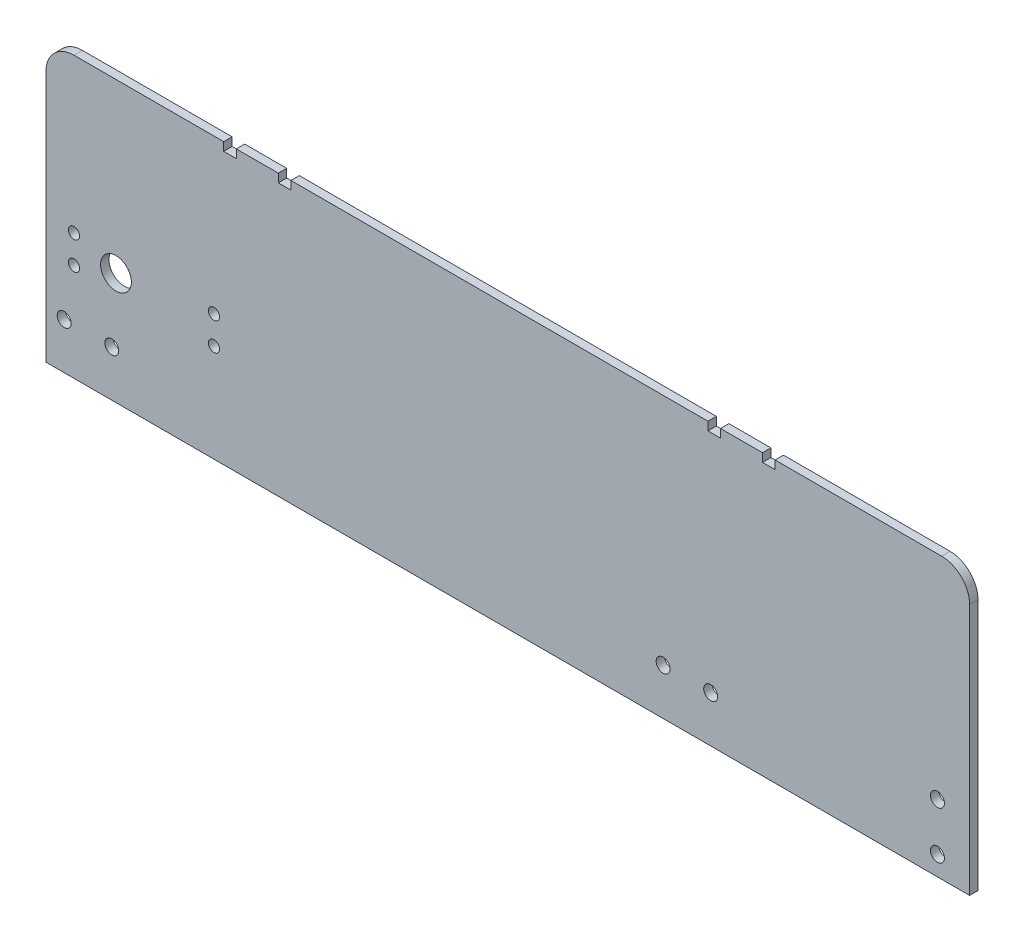
ISO-10303-21;
HEADER;
FILE_DESCRIPTION(('STEP AP214'),'2;1');
FILE_NAME('part.step','',(''),(''),'','','');
FILE_SCHEMA(('AUTOMOTIVE_DESIGN { 1 0 10303 214 1 1 1 1 }'));
ENDSEC;
DATA;
#1=APPLICATION_CONTEXT('core data for automotive mechanical design processes');
#2=APPLICATION_PROTOCOL_DEFINITION('international standard','automotive_design',2000,#1);
#3=PRODUCT_CONTEXT('',#1,'mechanical');
#4=PRODUCT('Part','Part','',(#3));
#5=PRODUCT_RELATED_PRODUCT_CATEGORY('part','',(#4));
#6=PRODUCT_DEFINITION_FORMATION('','',#4);
#7=PRODUCT_DEFINITION_CONTEXT('part definition',#1,'design');
#8=PRODUCT_DEFINITION('design','',#6,#7);
#9=PRODUCT_DEFINITION_SHAPE('','',#8);
#10=(LENGTH_UNIT() NAMED_UNIT(*) SI_UNIT(.MILLI.,.METRE.));
#11=(NAMED_UNIT(*) PLANE_ANGLE_UNIT() SI_UNIT($,.RADIAN.));
#12=(NAMED_UNIT(*) SI_UNIT($,.STERADIAN.) SOLID_ANGLE_UNIT());
#13=UNCERTAINTY_MEASURE_WITH_UNIT(LENGTH_MEASURE(1.E-05),#10,'distance_accuracy_value','');
#14=(GEOMETRIC_REPRESENTATION_CONTEXT(3) GLOBAL_UNCERTAINTY_ASSIGNED_CONTEXT((#13)) GLOBAL_UNIT_ASSIGNED_CONTEXT((#10,
#11,#12)) REPRESENTATION_CONTEXT('',''));
#15=CARTESIAN_POINT('',(0.,0.,0.));
#16=DIRECTION('',(0.,0.,1.));
#17=DIRECTION('',(1.,0.,0.));
#18=AXIS2_PLACEMENT_3D('',#15,#16,#17);
#19=CARTESIAN_POINT('',(10.,100.,1.5));
#20=DIRECTION('',(0.,-1.,0.));
#21=DIRECTION('',(0.,0.,-1.));
#22=AXIS2_PLACEMENT_3D('',#19,#20,#21);
#23=PLANE('',#22);
#24=DIRECTION('',(-1.,0.,0.));
#25=VECTOR('',#24,1.);
#26=CARTESIAN_POINT('',(10.,100.,1.5));
#27=LINE('',#26,#25);
#28=CARTESIAN_POINT('',(83.,100.,1.5));
#29=VERTEX_POINT('',#28);
#30=CARTESIAN_POINT('',(68.,100.,1.5));
#31=VERTEX_POINT('',#30);
#32=EDGE_CURVE('E345',#29,#31,#27,.T.);
#33=ORIENTED_EDGE('',*,*,#32,.F.);
#34=DIRECTION('',(0.,0.,1.));
#35=VECTOR('',#34,1.);
#36=CARTESIAN_POINT('',(83.,100.,-8.5));
#37=LINE('',#36,#35);
#38=CARTESIAN_POINT('',(83.,100.,-1.5));
#39=VERTEX_POINT('',#38);
#40=EDGE_CURVE('E199',#39,#29,#37,.T.);
#41=ORIENTED_EDGE('',*,*,#40,.F.);
#42=DIRECTION('',(-1.,0.,0.));
#43=VECTOR('',#42,1.);
#44=CARTESIAN_POINT('',(10.,100.,-1.5));
#45=LINE('',#44,#43);
#46=CARTESIAN_POINT('',(68.,100.,-1.5));
#47=VERTEX_POINT('',#46);
#48=EDGE_CURVE('E361',#39,#47,#45,.T.);
#49=ORIENTED_EDGE('',*,*,#48,.T.);
#50=DIRECTION('',(0.,0.,1.));
#51=VECTOR('',#50,1.);
#52=CARTESIAN_POINT('',(68.,100.,1.5));
#53=LINE('',#52,#51);
#54=EDGE_CURVE('E390',#47,#31,#53,.T.);
#55=ORIENTED_EDGE('',*,*,#54,.T.);
#56=EDGE_LOOP('',(#33,#41,#49,#55));
#57=FACE_BOUND('',#56,.T.);
#58=ADVANCED_FACE('F37',(#57),#23,.F.);
#59=CARTESIAN_POINT('',(236.5,100.,-1.5));
#60=VERTEX_POINT('',#59);
#61=CARTESIAN_POINT('',(87.5,100.,-1.5));
#62=VERTEX_POINT('',#61);
#63=EDGE_CURVE('E418',#60,#62,#45,.T.);
#64=ORIENTED_EDGE('',*,*,#63,.T.);
#65=DIRECTION('',(0.,0.,1.));
#66=VECTOR('',#65,1.);
#67=CARTESIAN_POINT('',(87.5,100.,-8.5));
#68=LINE('',#67,#66);
#69=CARTESIAN_POINT('',(87.5,100.,1.5));
#70=VERTEX_POINT('',#69);
#71=EDGE_CURVE('E212',#62,#70,#68,.T.);
#72=ORIENTED_EDGE('',*,*,#71,.T.);
#73=CARTESIAN_POINT('',(236.5,100.,1.5));
#74=VERTEX_POINT('',#73);
#75=EDGE_CURVE('E443',#74,#70,#27,.T.);
#76=ORIENTED_EDGE('',*,*,#75,.F.);
#77=DIRECTION('',(0.,0.,1.));
#78=VECTOR('',#77,1.);
#79=CARTESIAN_POINT('',(236.5,100.,-8.5));
#80=LINE('',#79,#78);
#81=EDGE_CURVE('E223',#60,#74,#80,.T.);
#82=ORIENTED_EDGE('',*,*,#81,.F.);
#83=EDGE_LOOP('',(#64,#72,#76,#82));
#84=FACE_BOUND('',#83,.T.);
#85=ADVANCED_FACE('F422',(#84),#23,.F.);
#86=CARTESIAN_POINT('',(63.5,100.,1.5));
#87=VERTEX_POINT('',#86);
#88=CARTESIAN_POINT('',(10.,100.,1.5));
#89=VERTEX_POINT('',#88);
#90=EDGE_CURVE('E339',#87,#89,#27,.T.);
#91=ORIENTED_EDGE('',*,*,#90,.F.);
#92=DIRECTION('',(0.,0.,-1.));
#93=VECTOR('',#92,1.);
#94=CARTESIAN_POINT('',(63.5,100.,1.5));
#95=LINE('',#94,#93);
#96=CARTESIAN_POINT('',(63.5,100.,-1.5));
#97=VERTEX_POINT('',#96);
#98=EDGE_CURVE('E393',#87,#97,#95,.T.);
#99=ORIENTED_EDGE('',*,*,#98,.T.);
#100=CARTESIAN_POINT('',(10.,100.,-1.5));
#101=VERTEX_POINT('',#100);
#102=EDGE_CURVE('E356',#97,#101,#45,.T.);
#103=ORIENTED_EDGE('',*,*,#102,.T.);
#104=DIRECTION('',(0.,0.,-1.));
#105=VECTOR('',#104,1.);
#106=CARTESIAN_POINT('',(10.,100.,1.5));
#107=LINE('',#106,#105);
#108=EDGE_CURVE('E365',#89,#101,#107,.T.);
#109=ORIENTED_EDGE('',*,*,#108,.F.);
#110=EDGE_LOOP('',(#91,#99,#103,#109));
#111=FACE_BOUND('',#110,.T.);
#112=ADVANCED_FACE('F429',(#111),#23,.F.);
#113=CARTESIAN_POINT('',(256.,100.,-1.5));
#114=VERTEX_POINT('',#113);
#115=CARTESIAN_POINT('',(241.,100.,-1.5));
#116=VERTEX_POINT('',#115);
#117=EDGE_CURVE('E360',#114,#116,#45,.T.);
#118=ORIENTED_EDGE('',*,*,#117,.T.);
#119=DIRECTION('',(0.,0.,1.));
#120=VECTOR('',#119,1.);
#121=CARTESIAN_POINT('',(241.,100.,-8.5));
#122=LINE('',#121,#120);
#123=CARTESIAN_POINT('',(241.,100.,1.5));
#124=VERTEX_POINT('',#123);
#125=EDGE_CURVE('E220',#116,#124,#122,.T.);
#126=ORIENTED_EDGE('',*,*,#125,.T.);
#127=CARTESIAN_POINT('',(256.,100.,1.5));
#128=VERTEX_POINT('',#127);
#129=EDGE_CURVE('E344',#128,#124,#27,.T.);
#130=ORIENTED_EDGE('',*,*,#129,.F.);
#131=DIRECTION('',(0.,0.,-1.));
#132=VECTOR('',#131,1.);
#133=CARTESIAN_POINT('',(256.,100.,1.5));
#134=LINE('',#133,#132);
#135=EDGE_CURVE('E387',#128,#114,#134,.T.);
#136=ORIENTED_EDGE('',*,*,#135,.T.);
#137=EDGE_LOOP('',(#118,#126,#130,#136));
#138=FACE_BOUND('',#137,.T.);
#139=ADVANCED_FACE('F458',(#138),#23,.F.);
#140=CARTESIAN_POINT('',(10.,90.,1.5));
#141=DIRECTION('',(0.,0.,1.));
#142=DIRECTION('',(1.,0.,0.));
#143=AXIS2_PLACEMENT_3D('',#140,#141,#142);
#144=PLANE('',#143);
#145=DIRECTION('',(0.,-1.,0.));
#146=VECTOR('',#145,1.);
#147=CARTESIAN_POINT('',(83.,100.,1.5));
#148=LINE('',#147,#146);
#149=CARTESIAN_POINT('',(83.,97.,1.5));
#150=VERTEX_POINT('',#149);
#151=EDGE_CURVE('E196',#29,#150,#148,.T.);
#152=ORIENTED_EDGE('',*,*,#151,.F.);
#153=ORIENTED_EDGE('',*,*,#32,.T.);
#154=DIRECTION('',(0.,1.,0.));
#155=VECTOR('',#154,1.);
#156=CARTESIAN_POINT('',(68.,100.,1.5));
#157=LINE('',#156,#155);
#158=CARTESIAN_POINT('',(68.,97.,1.5));
#159=VERTEX_POINT('',#158);
#160=EDGE_CURVE('E237',#159,#31,#157,.T.);
#161=ORIENTED_EDGE('',*,*,#160,.F.);
#162=DIRECTION('',(1.,0.,0.));
#163=VECTOR('',#162,1.);
#164=CARTESIAN_POINT('',(63.5,97.,1.5));
#165=LINE('',#164,#163);
#166=CARTESIAN_POINT('',(63.5,97.,1.5));
#167=VERTEX_POINT('',#166);
#168=EDGE_CURVE('E233',#167,#159,#165,.T.);
#169=ORIENTED_EDGE('',*,*,#168,.F.);
#170=DIRECTION('',(0.,-1.,0.));
#171=VECTOR('',#170,1.);
#172=CARTESIAN_POINT('',(63.5,100.,1.5));
#173=LINE('',#172,#171);
#174=EDGE_CURVE('E230',#87,#167,#173,.T.);
#175=ORIENTED_EDGE('',*,*,#174,.F.);
#176=ORIENTED_EDGE('',*,*,#90,.T.);
#177=CARTESIAN_POINT('',(10.,90.,1.5));
#178=DIRECTION('',(0.,0.,1.));
#179=DIRECTION('',(1.,0.,0.));
#180=AXIS2_PLACEMENT_3D('',#177,#178,#179);
#181=CIRCLE('',#180,10.);
#182=CARTESIAN_POINT('',(0.,90.,1.5));
#183=VERTEX_POINT('',#182);
#184=EDGE_CURVE('E343',#89,#183,#181,.T.);
#185=ORIENTED_EDGE('',*,*,#184,.T.);
#186=DIRECTION('',(0.,-1.,0.));
#187=VECTOR('',#186,1.);
#188=CARTESIAN_POINT('',(0.,0.,1.5));
#189=LINE('',#188,#187);
#190=CARTESIAN_POINT('',(0.,0.,1.5));
#191=VERTEX_POINT('',#190);
#192=EDGE_CURVE('E329',#183,#191,#189,.T.);
#193=ORIENTED_EDGE('',*,*,#192,.T.);
#194=DIRECTION('',(1.,0.,0.));
#195=VECTOR('',#194,1.);
#196=CARTESIAN_POINT('',(0.,0.,1.5));
#197=LINE('',#196,#195);
#198=CARTESIAN_POINT('',(330.,0.,1.5));
#199=VERTEX_POINT('',#198);
#200=EDGE_CURVE('E332',#191,#199,#197,.T.);
#201=ORIENTED_EDGE('',*,*,#200,.T.);
#202=DIRECTION('',(0.,1.,0.));
#203=VECTOR('',#202,1.);
#204=CARTESIAN_POINT('',(330.,0.,1.5));
#205=LINE('',#204,#203);
#206=CARTESIAN_POINT('',(330.,90.,1.5));
#207=VERTEX_POINT('',#206);
#208=EDGE_CURVE('E335',#199,#207,#205,.T.);
#209=ORIENTED_EDGE('',*,*,#208,.T.);
#210=CARTESIAN_POINT('',(320.,90.,1.5));
#211=DIRECTION('',(0.,0.,1.));
#212=DIRECTION('',(1.,0.,0.));
#213=AXIS2_PLACEMENT_3D('',#210,#211,#212);
#214=CIRCLE('',#213,10.);
#215=CARTESIAN_POINT('',(320.,100.,1.5));
#216=VERTEX_POINT('',#215);
#217=EDGE_CURVE('E337',#207,#216,#214,.T.);
#218=ORIENTED_EDGE('',*,*,#217,.T.);
#219=CARTESIAN_POINT('',(260.5,100.,1.5));
#220=VERTEX_POINT('',#219);
#221=EDGE_CURVE('E340',#216,#220,#27,.T.);
#222=ORIENTED_EDGE('',*,*,#221,.T.);
#223=DIRECTION('',(0.,1.,0.));
#224=VECTOR('',#223,1.);
#225=CARTESIAN_POINT('',(260.5,100.,1.5));
#226=LINE('',#225,#224);
#227=CARTESIAN_POINT('',(260.5,97.,1.5));
#228=VERTEX_POINT('',#227);
#229=EDGE_CURVE('E247',#228,#220,#226,.T.);
#230=ORIENTED_EDGE('',*,*,#229,.F.);
#231=DIRECTION('',(1.,0.,0.));
#232=VECTOR('',#231,1.);
#233=CARTESIAN_POINT('',(256.,97.,1.5));
#234=LINE('',#233,#232);
#235=CARTESIAN_POINT('',(256.,97.,1.5));
#236=VERTEX_POINT('',#235);
#237=EDGE_CURVE('E250',#236,#228,#234,.T.);
#238=ORIENTED_EDGE('',*,*,#237,.F.);
#239=DIRECTION('',(0.,-1.,0.));
#240=VECTOR('',#239,1.);
#241=CARTESIAN_POINT('',(256.,100.,1.5));
#242=LINE('',#241,#240);
#243=EDGE_CURVE('E234',#128,#236,#242,.T.);
#244=ORIENTED_EDGE('',*,*,#243,.F.);
#245=ORIENTED_EDGE('',*,*,#129,.T.);
#246=DIRECTION('',(0.,1.,0.));
#247=VECTOR('',#246,1.);
#248=CARTESIAN_POINT('',(241.,100.,1.5));
#249=LINE('',#248,#247);
#250=CARTESIAN_POINT('',(241.,97.,1.5));
#251=VERTEX_POINT('',#250);
#252=EDGE_CURVE('E218',#251,#124,#249,.T.);
#253=ORIENTED_EDGE('',*,*,#252,.F.);
#254=DIRECTION('',(1.,0.,0.));
#255=VECTOR('',#254,1.);
#256=CARTESIAN_POINT('',(236.5,97.,1.5));
#257=LINE('',#256,#255);
#258=CARTESIAN_POINT('',(236.5,97.,1.5));
#259=VERTEX_POINT('',#258);
#260=EDGE_CURVE('E226',#259,#251,#257,.T.);
#261=ORIENTED_EDGE('',*,*,#260,.F.);
#262=DIRECTION('',(0.,-1.,0.));
#263=VECTOR('',#262,1.);
#264=CARTESIAN_POINT('',(236.5,100.,1.5));
#265=LINE('',#264,#263);
#266=EDGE_CURVE('E202',#74,#259,#265,.T.);
#267=ORIENTED_EDGE('',*,*,#266,.F.);
#268=ORIENTED_EDGE('',*,*,#75,.T.);
#269=DIRECTION('',(0.,1.,0.));
#270=VECTOR('',#269,1.);
#271=CARTESIAN_POINT('',(87.5,100.,1.5));
#272=LINE('',#271,#270);
#273=CARTESIAN_POINT('',(87.5,97.,1.5));
#274=VERTEX_POINT('',#273);
#275=EDGE_CURVE('E193',#274,#70,#272,.T.);
#276=ORIENTED_EDGE('',*,*,#275,.F.);
#277=DIRECTION('',(1.,0.,0.));
#278=VECTOR('',#277,1.);
#279=CARTESIAN_POINT('',(83.,97.,1.5));
#280=LINE('',#279,#278);
#281=EDGE_CURVE('E188',#150,#274,#280,.T.);
#282=ORIENTED_EDGE('',*,*,#281,.F.);
#283=EDGE_LOOP('',(#152,#153,#161,#169,#175,#176,#185,#193,#201,#209,#218,#222,#230,#238,#244,
#245,#253,#261,#267,#268,#276,#282));
#284=FACE_BOUND('',#283,.T.);
#285=CARTESIAN_POINT('',(318.5,24.,1.5));
#286=DIRECTION('',(0.,0.,1.));
#287=DIRECTION('',(1.,0.,0.));
#288=AXIS2_PLACEMENT_3D('',#285,#286,#287);
#289=CIRCLE('',#288,2.50000000000002);
#290=CARTESIAN_POINT('',(321.,24.,1.5));
#291=VERTEX_POINT('',#290);
#292=EDGE_CURVE('E267',#291,#291,#289,.T.);
#293=ORIENTED_EDGE('',*,*,#292,.F.);
#294=EDGE_LOOP('',(#293));
#295=FACE_BOUND('',#294,.T.);
#296=CARTESIAN_POINT('',(318.5,7.,1.5));
#297=DIRECTION('',(0.,0.,1.));
#298=DIRECTION('',(1.,0.,0.));
#299=AXIS2_PLACEMENT_3D('',#296,#297,#298);
#300=CIRCLE('',#299,2.50000000000002);
#301=CARTESIAN_POINT('',(321.,7.,1.5));
#302=VERTEX_POINT('',#301);
#303=EDGE_CURVE('E266',#302,#302,#300,.T.);
#304=ORIENTED_EDGE('',*,*,#303,.F.);
#305=EDGE_LOOP('',(#304));
#306=FACE_BOUND('',#305,.T.);
#307=CARTESIAN_POINT('',(220.5,16.5,1.5));
#308=DIRECTION('',(0.,0.,1.));
#309=DIRECTION('',(1.,0.,0.));
#310=AXIS2_PLACEMENT_3D('',#307,#308,#309);
#311=CIRCLE('',#310,2.50000000000002);
#312=CARTESIAN_POINT('',(223.,16.5,1.5));
#313=VERTEX_POINT('',#312);
#314=EDGE_CURVE('E281',#313,#313,#311,.T.);
#315=ORIENTED_EDGE('',*,*,#314,.F.);
#316=EDGE_LOOP('',(#315));
#317=FACE_BOUND('',#316,.T.);
#318=CARTESIAN_POINT('',(6.5,16.5,1.5));
#319=DIRECTION('',(0.,0.,1.));
#320=DIRECTION('',(1.,0.,0.));
#321=AXIS2_PLACEMENT_3D('',#318,#319,#320);
#322=CIRCLE('',#321,2.5);
#323=CARTESIAN_POINT('',(9.,16.5,1.5));
#324=VERTEX_POINT('',#323);
#325=EDGE_CURVE('E293',#324,#324,#322,.T.);
#326=ORIENTED_EDGE('',*,*,#325,.F.);
#327=EDGE_LOOP('',(#326));
#328=FACE_BOUND('',#327,.T.);
#329=CARTESIAN_POINT('',(60.,35.,1.5));
#330=DIRECTION('',(0.,0.,1.));
#331=DIRECTION('',(1.,0.,0.));
#332=AXIS2_PLACEMENT_3D('',#329,#330,#331);
#333=CIRCLE('',#332,2.);
#334=CARTESIAN_POINT('',(62.,35.,1.5));
#335=VERTEX_POINT('',#334);
#336=EDGE_CURVE('E305',#335,#335,#333,.T.);
#337=ORIENTED_EDGE('',*,*,#336,.F.);
#338=EDGE_LOOP('',(#337));
#339=FACE_BOUND('',#338,.T.);
#340=CARTESIAN_POINT('',(9.99999999999999,45.,1.5));
#341=DIRECTION('',(0.,0.,1.));
#342=DIRECTION('',(1.,0.,0.));
#343=AXIS2_PLACEMENT_3D('',#340,#341,#342);
#344=CIRCLE('',#343,2.);
#345=CARTESIAN_POINT('',(12.,45.,1.5));
#346=VERTEX_POINT('',#345);
#347=EDGE_CURVE('E317',#346,#346,#344,.T.);
#348=ORIENTED_EDGE('',*,*,#347,.F.);
#349=EDGE_LOOP('',(#348));
#350=FACE_BOUND('',#349,.T.);
#351=CARTESIAN_POINT('',(9.99999999999999,35.,1.5));
#352=DIRECTION('',(0.,0.,1.));
#353=DIRECTION('',(1.,0.,0.));
#354=AXIS2_PLACEMENT_3D('',#351,#352,#353);
#355=CIRCLE('',#354,2.);
#356=CARTESIAN_POINT('',(12.,35.,1.5));
#357=VERTEX_POINT('',#356);
#358=EDGE_CURVE('E323',#357,#357,#355,.T.);
#359=ORIENTED_EDGE('',*,*,#358,.F.);
#360=EDGE_LOOP('',(#359));
#361=FACE_BOUND('',#360,.T.);
#362=CARTESIAN_POINT('',(60.,45.,1.5));
#363=DIRECTION('',(0.,0.,1.));
#364=DIRECTION('',(1.,0.,0.));
#365=AXIS2_PLACEMENT_3D('',#362,#363,#364);
#366=CIRCLE('',#365,2.);
#367=CARTESIAN_POINT('',(62.,45.,1.5));
#368=VERTEX_POINT('',#367);
#369=EDGE_CURVE('E311',#368,#368,#366,.T.);
#370=ORIENTED_EDGE('',*,*,#369,.F.);
#371=EDGE_LOOP('',(#370));
#372=FACE_BOUND('',#371,.T.);
#373=CARTESIAN_POINT('',(25.,40.0000000000001,1.5));
#374=DIRECTION('',(0.,0.,1.));
#375=DIRECTION('',(1.,0.,0.));
#376=AXIS2_PLACEMENT_3D('',#373,#374,#375);
#377=CIRCLE('',#376,5.49999999999998);
#378=CARTESIAN_POINT('',(30.5,40.0000000000001,1.5));
#379=VERTEX_POINT('',#378);
#380=EDGE_CURVE('E299',#379,#379,#377,.T.);
#381=ORIENTED_EDGE('',*,*,#380,.F.);
#382=EDGE_LOOP('',(#381));
#383=FACE_BOUND('',#382,.T.);
#384=CARTESIAN_POINT('',(23.5,16.5,1.5));
#385=DIRECTION('',(0.,0.,1.));
#386=DIRECTION('',(1.,0.,0.));
#387=AXIS2_PLACEMENT_3D('',#384,#385,#386);
#388=CIRCLE('',#387,2.5);
#389=CARTESIAN_POINT('',(26.,16.5,1.5));
#390=VERTEX_POINT('',#389);
#391=EDGE_CURVE('E287',#390,#390,#388,.T.);
#392=ORIENTED_EDGE('',*,*,#391,.F.);
#393=EDGE_LOOP('',(#392));
#394=FACE_BOUND('',#393,.T.);
#395=CARTESIAN_POINT('',(237.5,16.5,1.5));
#396=DIRECTION('',(0.,0.,1.));
#397=DIRECTION('',(1.,0.,0.));
#398=AXIS2_PLACEMENT_3D('',#395,#396,#397);
#399=CIRCLE('',#398,2.50000000000002);
#400=CARTESIAN_POINT('',(240.,16.5,1.5));
#401=VERTEX_POINT('',#400);
#402=EDGE_CURVE('E273',#401,#401,#399,.T.);
#403=ORIENTED_EDGE('',*,*,#402,.F.);
#404=EDGE_LOOP('',(#403));
#405=FACE_BOUND('',#404,.T.);
#406=ADVANCED_FACE('F204',(#284,#295,#306,#317,#328,#339,#350,#361,#372,#383,#394,#405),#144,.T.);
#407=CARTESIAN_POINT('',(10.,90.,-1.5));
#408=DIRECTION('',(0.,0.,1.));
#409=DIRECTION('',(1.,0.,0.));
#410=AXIS2_PLACEMENT_3D('',#407,#408,#409);
#411=PLANE('',#410);
#412=ORIENTED_EDGE('',*,*,#48,.F.);
#413=DIRECTION('',(0.,-1.,0.));
#414=VECTOR('',#413,1.);
#415=CARTESIAN_POINT('',(83.,89.9999999999997,-1.5));
#416=LINE('',#415,#414);
#417=CARTESIAN_POINT('',(83.,97.,-1.5));
#418=VERTEX_POINT('',#417);
#419=EDGE_CURVE('E11',#39,#418,#416,.T.);
#420=ORIENTED_EDGE('',*,*,#419,.T.);
#421=DIRECTION('',(1.,0.,0.));
#422=VECTOR('',#421,1.);
#423=CARTESIAN_POINT('',(10.,97.,-1.5));
#424=LINE('',#423,#422);
#425=CARTESIAN_POINT('',(87.5,97.,-1.5));
#426=VERTEX_POINT('',#425);
#427=EDGE_CURVE('E191',#418,#426,#424,.T.);
#428=ORIENTED_EDGE('',*,*,#427,.T.);
#429=DIRECTION('',(0.,1.,0.));
#430=VECTOR('',#429,1.);
#431=CARTESIAN_POINT('',(87.5,90.,-1.5));
#432=LINE('',#431,#430);
#433=EDGE_CURVE('E45',#426,#62,#432,.T.);
#434=ORIENTED_EDGE('',*,*,#433,.T.);
#435=ORIENTED_EDGE('',*,*,#63,.F.);
#436=DIRECTION('',(0.,-1.,0.));
#437=VECTOR('',#436,1.);
#438=CARTESIAN_POINT('',(236.5,90.,-1.5));
#439=LINE('',#438,#437);
#440=CARTESIAN_POINT('',(236.5,97.,-1.5));
#441=VERTEX_POINT('',#440);
#442=EDGE_CURVE('E408',#60,#441,#439,.T.);
#443=ORIENTED_EDGE('',*,*,#442,.T.);
#444=DIRECTION('',(1.,0.,0.));
#445=VECTOR('',#444,1.);
#446=CARTESIAN_POINT('',(10.,97.,-1.5));
#447=LINE('',#446,#445);
#448=CARTESIAN_POINT('',(241.,97.,-1.5));
#449=VERTEX_POINT('',#448);
#450=EDGE_CURVE('E402',#441,#449,#447,.T.);
#451=ORIENTED_EDGE('',*,*,#450,.T.);
#452=DIRECTION('',(0.,1.,0.));
#453=VECTOR('',#452,1.);
#454=CARTESIAN_POINT('',(241.,90.,-1.5));
#455=LINE('',#454,#453);
#456=EDGE_CURVE('E405',#449,#116,#455,.T.);
#457=ORIENTED_EDGE('',*,*,#456,.T.);
#458=ORIENTED_EDGE('',*,*,#117,.F.);
#459=DIRECTION('',(0.,-1.,0.));
#460=VECTOR('',#459,1.);
#461=CARTESIAN_POINT('',(256.,90.,-1.5));
#462=LINE('',#461,#460);
#463=CARTESIAN_POINT('',(256.,97.,-1.5));
#464=VERTEX_POINT('',#463);
#465=EDGE_CURVE('E257',#114,#464,#462,.T.);
#466=ORIENTED_EDGE('',*,*,#465,.T.);
#467=DIRECTION('',(1.,0.,0.));
#468=VECTOR('',#467,1.);
#469=CARTESIAN_POINT('',(10.,97.,-1.5));
#470=LINE('',#469,#468);
#471=CARTESIAN_POINT('',(260.5,97.,-1.5));
#472=VERTEX_POINT('',#471);
#473=EDGE_CURVE('E396',#464,#472,#470,.T.);
#474=ORIENTED_EDGE('',*,*,#473,.T.);
#475=DIRECTION('',(0.,1.,0.));
#476=VECTOR('',#475,1.);
#477=CARTESIAN_POINT('',(260.5,90.,-1.5));
#478=LINE('',#477,#476);
#479=CARTESIAN_POINT('',(260.5,100.,-1.5));
#480=VERTEX_POINT('',#479);
#481=EDGE_CURVE('E243',#472,#480,#478,.T.);
#482=ORIENTED_EDGE('',*,*,#481,.T.);
#483=CARTESIAN_POINT('',(320.,100.,-1.5));
#484=VERTEX_POINT('',#483);
#485=EDGE_CURVE('E357',#484,#480,#45,.T.);
#486=ORIENTED_EDGE('',*,*,#485,.F.);
#487=CARTESIAN_POINT('',(320.,90.,-1.5));
#488=DIRECTION('',(0.,0.,1.));
#489=DIRECTION('',(1.,0.,0.));
#490=AXIS2_PLACEMENT_3D('',#487,#488,#489);
#491=CIRCLE('',#490,10.);
#492=CARTESIAN_POINT('',(330.,90.,-1.5));
#493=VERTEX_POINT('',#492);
#494=EDGE_CURVE('E354',#493,#484,#491,.T.);
#495=ORIENTED_EDGE('',*,*,#494,.F.);
#496=DIRECTION('',(0.,1.,0.));
#497=VECTOR('',#496,1.);
#498=CARTESIAN_POINT('',(330.,0.,-1.5));
#499=LINE('',#498,#497);
#500=CARTESIAN_POINT('',(330.,0.,-1.5));
#501=VERTEX_POINT('',#500);
#502=EDGE_CURVE('E352',#501,#493,#499,.T.);
#503=ORIENTED_EDGE('',*,*,#502,.F.);
#504=DIRECTION('',(1.,0.,0.));
#505=VECTOR('',#504,1.);
#506=CARTESIAN_POINT('',(208.999329080325,0.,-1.5));
#507=LINE('',#506,#505);
#508=CARTESIAN_POINT('',(0.,0.,-1.5));
#509=VERTEX_POINT('',#508);
#510=EDGE_CURVE('E350',#509,#501,#507,.T.);
#511=ORIENTED_EDGE('',*,*,#510,.F.);
#512=DIRECTION('',(0.,-1.,0.));
#513=VECTOR('',#512,1.);
#514=CARTESIAN_POINT('',(0.,0.,-1.5));
#515=LINE('',#514,#513);
#516=CARTESIAN_POINT('',(0.,90.,-1.5));
#517=VERTEX_POINT('',#516);
#518=EDGE_CURVE('E326',#517,#509,#515,.T.);
#519=ORIENTED_EDGE('',*,*,#518,.F.);
#520=CARTESIAN_POINT('',(10.,90.,-1.5));
#521=DIRECTION('',(0.,0.,1.));
#522=DIRECTION('',(1.,0.,0.));
#523=AXIS2_PLACEMENT_3D('',#520,#521,#522);
#524=CIRCLE('',#523,10.);
#525=EDGE_CURVE('E333',#101,#517,#524,.T.);
#526=ORIENTED_EDGE('',*,*,#525,.F.);
#527=ORIENTED_EDGE('',*,*,#102,.F.);
#528=DIRECTION('',(0.,-1.,0.));
#529=VECTOR('',#528,1.);
#530=CARTESIAN_POINT('',(63.5,90.,-1.5));
#531=LINE('',#530,#529);
#532=CARTESIAN_POINT('',(63.5,97.,-1.5));
#533=VERTEX_POINT('',#532);
#534=EDGE_CURVE('E263',#97,#533,#531,.T.);
#535=ORIENTED_EDGE('',*,*,#534,.T.);
#536=DIRECTION('',(1.,0.,0.));
#537=VECTOR('',#536,1.);
#538=CARTESIAN_POINT('',(10.,97.,-1.5));
#539=LINE('',#538,#537);
#540=CARTESIAN_POINT('',(68.,97.,-1.5));
#541=VERTEX_POINT('',#540);
#542=EDGE_CURVE('E399',#533,#541,#539,.T.);
#543=ORIENTED_EDGE('',*,*,#542,.T.);
#544=DIRECTION('',(0.,1.,0.));
#545=VECTOR('',#544,1.);
#546=CARTESIAN_POINT('',(68.,90.,-1.5));
#547=LINE('',#546,#545);
#548=EDGE_CURVE('E260',#541,#47,#547,.T.);
#549=ORIENTED_EDGE('',*,*,#548,.T.);
#550=EDGE_LOOP('',(#412,#420,#428,#434,#435,#443,#451,#457,#458,#466,#474,#482,#486,#495,#503,
#511,#519,#526,#527,#535,#543,#549));
#551=FACE_BOUND('',#550,.T.);
#552=CARTESIAN_POINT('',(318.5,24.,-1.5));
#553=DIRECTION('',(0.,0.,1.));
#554=DIRECTION('',(1.,0.,0.));
#555=AXIS2_PLACEMENT_3D('',#552,#553,#554);
#556=CIRCLE('',#555,2.50000000000002);
#557=CARTESIAN_POINT('',(321.,24.,-1.5));
#558=VERTEX_POINT('',#557);
#559=EDGE_CURVE('E280',#558,#558,#556,.T.);
#560=ORIENTED_EDGE('',*,*,#559,.T.);
#561=EDGE_LOOP('',(#560));
#562=FACE_BOUND('',#561,.T.);
#563=CARTESIAN_POINT('',(318.5,7.,-1.5));
#564=DIRECTION('',(0.,0.,1.));
#565=DIRECTION('',(1.,0.,0.));
#566=AXIS2_PLACEMENT_3D('',#563,#564,#565);
#567=CIRCLE('',#566,2.50000000000002);
#568=CARTESIAN_POINT('',(321.,7.,-1.5));
#569=VERTEX_POINT('',#568);
#570=EDGE_CURVE('E270',#569,#569,#567,.T.);
#571=ORIENTED_EDGE('',*,*,#570,.T.);
#572=EDGE_LOOP('',(#571));
#573=FACE_BOUND('',#572,.T.);
#574=CARTESIAN_POINT('',(9.99999999999999,35.,-1.5));
#575=DIRECTION('',(0.,0.,1.));
#576=DIRECTION('',(1.,0.,0.));
#577=AXIS2_PLACEMENT_3D('',#574,#575,#576);
#578=CIRCLE('',#577,2.);
#579=CARTESIAN_POINT('',(12.,35.,-1.5));
#580=VERTEX_POINT('',#579);
#581=EDGE_CURVE('E320',#580,#580,#578,.T.);
#582=ORIENTED_EDGE('',*,*,#581,.T.);
#583=EDGE_LOOP('',(#582));
#584=FACE_BOUND('',#583,.T.);
#585=CARTESIAN_POINT('',(9.99999999999999,45.,-1.5));
#586=DIRECTION('',(0.,0.,1.));
#587=DIRECTION('',(1.,0.,0.));
#588=AXIS2_PLACEMENT_3D('',#585,#586,#587);
#589=CIRCLE('',#588,2.);
#590=CARTESIAN_POINT('',(12.,45.,-1.5));
#591=VERTEX_POINT('',#590);
#592=EDGE_CURVE('E314',#591,#591,#589,.T.);
#593=ORIENTED_EDGE('',*,*,#592,.T.);
#594=EDGE_LOOP('',(#593));
#595=FACE_BOUND('',#594,.T.);
#596=CARTESIAN_POINT('',(60.,45.,-1.5));
#597=DIRECTION('',(0.,0.,1.));
#598=DIRECTION('',(1.,0.,0.));
#599=AXIS2_PLACEMENT_3D('',#596,#597,#598);
#600=CIRCLE('',#599,2.);
#601=CARTESIAN_POINT('',(62.,45.,-1.5));
#602=VERTEX_POINT('',#601);
#603=EDGE_CURVE('E308',#602,#602,#600,.T.);
#604=ORIENTED_EDGE('',*,*,#603,.T.);
#605=EDGE_LOOP('',(#604));
#606=FACE_BOUND('',#605,.T.);
#607=CARTESIAN_POINT('',(60.,35.,-1.5));
#608=DIRECTION('',(0.,0.,1.));
#609=DIRECTION('',(1.,0.,0.));
#610=AXIS2_PLACEMENT_3D('',#607,#608,#609);
#611=CIRCLE('',#610,2.);
#612=CARTESIAN_POINT('',(62.,35.,-1.5));
#613=VERTEX_POINT('',#612);
#614=EDGE_CURVE('E302',#613,#613,#611,.T.);
#615=ORIENTED_EDGE('',*,*,#614,.T.);
#616=EDGE_LOOP('',(#615));
#617=FACE_BOUND('',#616,.T.);
#618=CARTESIAN_POINT('',(25.,40.0000000000001,-1.5));
#619=DIRECTION('',(0.,0.,1.));
#620=DIRECTION('',(1.,0.,0.));
#621=AXIS2_PLACEMENT_3D('',#618,#619,#620);
#622=CIRCLE('',#621,5.49999999999998);
#623=CARTESIAN_POINT('',(30.5,40.0000000000001,-1.5));
#624=VERTEX_POINT('',#623);
#625=EDGE_CURVE('E296',#624,#624,#622,.T.);
#626=ORIENTED_EDGE('',*,*,#625,.T.);
#627=EDGE_LOOP('',(#626));
#628=FACE_BOUND('',#627,.T.);
#629=CARTESIAN_POINT('',(6.5,16.5,-1.5));
#630=DIRECTION('',(0.,0.,1.));
#631=DIRECTION('',(1.,0.,0.));
#632=AXIS2_PLACEMENT_3D('',#629,#630,#631);
#633=CIRCLE('',#632,2.5);
#634=CARTESIAN_POINT('',(9.,16.5,-1.5));
#635=VERTEX_POINT('',#634);
#636=EDGE_CURVE('E290',#635,#635,#633,.T.);
#637=ORIENTED_EDGE('',*,*,#636,.T.);
#638=EDGE_LOOP('',(#637));
#639=FACE_BOUND('',#638,.T.);
#640=CARTESIAN_POINT('',(23.5,16.5,-1.5));
#641=DIRECTION('',(0.,0.,1.));
#642=DIRECTION('',(1.,0.,0.));
#643=AXIS2_PLACEMENT_3D('',#640,#641,#642);
#644=CIRCLE('',#643,2.5);
#645=CARTESIAN_POINT('',(26.,16.5,-1.5));
#646=VERTEX_POINT('',#645);
#647=EDGE_CURVE('E284',#646,#646,#644,.T.);
#648=ORIENTED_EDGE('',*,*,#647,.T.);
#649=EDGE_LOOP('',(#648));
#650=FACE_BOUND('',#649,.T.);
#651=CARTESIAN_POINT('',(220.5,16.5,-1.5));
#652=DIRECTION('',(0.,0.,1.));
#653=DIRECTION('',(1.,0.,0.));
#654=AXIS2_PLACEMENT_3D('',#651,#652,#653);
#655=CIRCLE('',#654,2.50000000000002);
#656=CARTESIAN_POINT('',(223.,16.5,-1.5));
#657=VERTEX_POINT('',#656);
#658=EDGE_CURVE('E276',#657,#657,#655,.T.);
#659=ORIENTED_EDGE('',*,*,#658,.T.);
#660=EDGE_LOOP('',(#659));
#661=FACE_BOUND('',#660,.T.);
#662=CARTESIAN_POINT('',(237.5,16.5,-1.5));
#663=DIRECTION('',(0.,0.,1.));
#664=DIRECTION('',(1.,0.,0.));
#665=AXIS2_PLACEMENT_3D('',#662,#663,#664);
#666=CIRCLE('',#665,2.50000000000002);
#667=CARTESIAN_POINT('',(240.,16.5,-1.5));
#668=VERTEX_POINT('',#667);
#669=EDGE_CURVE('E277',#668,#668,#666,.T.);
#670=ORIENTED_EDGE('',*,*,#669,.T.);
#671=EDGE_LOOP('',(#670));
#672=FACE_BOUND('',#671,.T.);
#673=ADVANCED_FACE('F416',(#551,#562,#573,#584,#595,#606,#617,#628,#639,#650,#661,#672),#411,.F.);
#674=CARTESIAN_POINT('',(0.,0.,1.5));
#675=DIRECTION('',(1.,0.,0.));
#676=DIRECTION('',(0.,0.,-1.));
#677=AXIS2_PLACEMENT_3D('',#674,#675,#676);
#678=PLANE('',#677);
#679=ORIENTED_EDGE('',*,*,#518,.T.);
#680=DIRECTION('',(0.,0.,-1.));
#681=VECTOR('',#680,1.);
#682=CARTESIAN_POINT('',(0.,0.,1.5));
#683=LINE('',#682,#681);
#684=EDGE_CURVE('E377',#191,#509,#683,.T.);
#685=ORIENTED_EDGE('',*,*,#684,.F.);
#686=ORIENTED_EDGE('',*,*,#192,.F.);
#687=DIRECTION('',(0.,0.,-1.));
#688=VECTOR('',#687,1.);
#689=CARTESIAN_POINT('',(0.,90.,1.5));
#690=LINE('',#689,#688);
#691=EDGE_CURVE('E347',#183,#517,#690,.T.);
#692=ORIENTED_EDGE('',*,*,#691,.T.);
#693=EDGE_LOOP('',(#679,#685,#686,#692));
#694=FACE_BOUND('',#693,.T.);
#695=ADVANCED_FACE('F39',(#694),#678,.F.);
#696=CARTESIAN_POINT('',(208.999329080325,0.,1.5));
#697=DIRECTION('',(0.,1.,0.));
#698=DIRECTION('',(0.,0.,1.));
#699=AXIS2_PLACEMENT_3D('',#696,#697,#698);
#700=PLANE('',#699);
#701=ORIENTED_EDGE('',*,*,#510,.T.);
#702=DIRECTION('',(0.,0.,-1.));
#703=VECTOR('',#702,1.);
#704=CARTESIAN_POINT('',(330.,0.,1.5));
#705=LINE('',#704,#703);
#706=EDGE_CURVE('E374',#199,#501,#705,.T.);
#707=ORIENTED_EDGE('',*,*,#706,.F.);
#708=ORIENTED_EDGE('',*,*,#200,.F.);
#709=ORIENTED_EDGE('',*,*,#684,.T.);
#710=EDGE_LOOP('',(#701,#707,#708,#709));
#711=FACE_BOUND('',#710,.T.);
#712=ADVANCED_FACE('F483',(#711),#700,.F.);
#713=CARTESIAN_POINT('',(330.,0.,1.5));
#714=DIRECTION('',(-1.,0.,0.));
#715=DIRECTION('',(0.,0.,1.));
#716=AXIS2_PLACEMENT_3D('',#713,#714,#715);
#717=PLANE('',#716);
#718=ORIENTED_EDGE('',*,*,#502,.T.);
#719=DIRECTION('',(0.,0.,-1.));
#720=VECTOR('',#719,1.);
#721=CARTESIAN_POINT('',(330.,90.,1.5));
#722=LINE('',#721,#720);
#723=EDGE_CURVE('E371',#207,#493,#722,.T.);
#724=ORIENTED_EDGE('',*,*,#723,.F.);
#725=ORIENTED_EDGE('',*,*,#208,.F.);
#726=ORIENTED_EDGE('',*,*,#706,.T.);
#727=EDGE_LOOP('',(#718,#724,#725,#726));
#728=FACE_BOUND('',#727,.T.);
#729=ADVANCED_FACE('F480',(#728),#717,.F.);
#730=CARTESIAN_POINT('',(320.,90.,1.5));
#731=DIRECTION('',(0.,0.,-1.));
#732=DIRECTION('',(-1.,0.,0.));
#733=AXIS2_PLACEMENT_3D('',#730,#731,#732);
#734=CYLINDRICAL_SURFACE('',#733,10.);
#735=ORIENTED_EDGE('',*,*,#494,.T.);
#736=DIRECTION('',(0.,0.,-1.));
#737=VECTOR('',#736,1.);
#738=CARTESIAN_POINT('',(320.,100.,1.5));
#739=LINE('',#738,#737);
#740=EDGE_CURVE('E368',#216,#484,#739,.T.);
#741=ORIENTED_EDGE('',*,*,#740,.F.);
#742=ORIENTED_EDGE('',*,*,#217,.F.);
#743=ORIENTED_EDGE('',*,*,#723,.T.);
#744=EDGE_LOOP('',(#735,#741,#742,#743));
#745=FACE_BOUND('',#744,.T.);
#746=ADVANCED_FACE('F477',(#745),#734,.T.);
#747=ORIENTED_EDGE('',*,*,#485,.T.);
#748=DIRECTION('',(0.,0.,1.));
#749=VECTOR('',#748,1.);
#750=CARTESIAN_POINT('',(260.5,100.,1.5));
#751=LINE('',#750,#749);
#752=EDGE_CURVE('E380',#480,#220,#751,.T.);
#753=ORIENTED_EDGE('',*,*,#752,.T.);
#754=ORIENTED_EDGE('',*,*,#221,.F.);
#755=ORIENTED_EDGE('',*,*,#740,.T.);
#756=EDGE_LOOP('',(#747,#753,#754,#755));
#757=FACE_BOUND('',#756,.T.);
#758=ADVANCED_FACE('F472',(#757),#23,.F.);
#759=CARTESIAN_POINT('',(10.,90.,1.5));
#760=DIRECTION('',(0.,0.,-1.));
#761=DIRECTION('',(-1.,0.,0.));
#762=AXIS2_PLACEMENT_3D('',#759,#760,#761);
#763=CYLINDRICAL_SURFACE('',#762,10.);
#764=ORIENTED_EDGE('',*,*,#525,.T.);
#765=ORIENTED_EDGE('',*,*,#691,.F.);
#766=ORIENTED_EDGE('',*,*,#184,.F.);
#767=ORIENTED_EDGE('',*,*,#108,.T.);
#768=EDGE_LOOP('',(#764,#765,#766,#767));
#769=FACE_BOUND('',#768,.T.);
#770=ADVANCED_FACE('F433',(#769),#763,.T.);
#771=CARTESIAN_POINT('',(9.99999999999999,35.,1.5));
#772=DIRECTION('',(0.,0.,-1.));
#773=DIRECTION('',(-1.,0.,0.));
#774=AXIS2_PLACEMENT_3D('',#771,#772,#773);
#775=CYLINDRICAL_SURFACE('',#774,2.);
#776=ORIENTED_EDGE('',*,*,#358,.T.);
#777=EDGE_LOOP('',(#776));
#778=FACE_BOUND('',#777,.T.);
#779=ORIENTED_EDGE('',*,*,#581,.F.);
#780=EDGE_LOOP('',(#779));
#781=FACE_BOUND('',#780,.T.);
#782=ADVANCED_FACE('F503',(#778,#781),#775,.F.);
#783=CARTESIAN_POINT('',(9.99999999999999,45.,1.5));
#784=DIRECTION('',(0.,0.,-1.));
#785=DIRECTION('',(-1.,0.,0.));
#786=AXIS2_PLACEMENT_3D('',#783,#784,#785);
#787=CYLINDRICAL_SURFACE('',#786,2.);
#788=ORIENTED_EDGE('',*,*,#347,.T.);
#789=EDGE_LOOP('',(#788));
#790=FACE_BOUND('',#789,.T.);
#791=ORIENTED_EDGE('',*,*,#592,.F.);
#792=EDGE_LOOP('',(#791));
#793=FACE_BOUND('',#792,.T.);
#794=ADVANCED_FACE('F766',(#790,#793),#787,.F.);
#795=CARTESIAN_POINT('',(60.,45.,1.5));
#796=DIRECTION('',(0.,0.,-1.));
#797=DIRECTION('',(-1.,0.,0.));
#798=AXIS2_PLACEMENT_3D('',#795,#796,#797);
#799=CYLINDRICAL_SURFACE('',#798,2.);
#800=ORIENTED_EDGE('',*,*,#369,.T.);
#801=EDGE_LOOP('',(#800));
#802=FACE_BOUND('',#801,.T.);
#803=ORIENTED_EDGE('',*,*,#603,.F.);
#804=EDGE_LOOP('',(#803));
#805=FACE_BOUND('',#804,.T.);
#806=ADVANCED_FACE('F755',(#802,#805),#799,.F.);
#807=CARTESIAN_POINT('',(60.,35.,1.5));
#808=DIRECTION('',(0.,0.,-1.));
#809=DIRECTION('',(-1.,0.,0.));
#810=AXIS2_PLACEMENT_3D('',#807,#808,#809);
#811=CYLINDRICAL_SURFACE('',#810,2.);
#812=ORIENTED_EDGE('',*,*,#336,.T.);
#813=EDGE_LOOP('',(#812));
#814=FACE_BOUND('',#813,.T.);
#815=ORIENTED_EDGE('',*,*,#614,.F.);
#816=EDGE_LOOP('',(#815));
#817=FACE_BOUND('',#816,.T.);
#818=ADVANCED_FACE('F744',(#814,#817),#811,.F.);
#819=CARTESIAN_POINT('',(25.,40.0000000000001,1.5));
#820=DIRECTION('',(0.,0.,-1.));
#821=DIRECTION('',(-1.,0.,0.));
#822=AXIS2_PLACEMENT_3D('',#819,#820,#821);
#823=CYLINDRICAL_SURFACE('',#822,5.49999999999998);
#824=ORIENTED_EDGE('',*,*,#380,.T.);
#825=EDGE_LOOP('',(#824));
#826=FACE_BOUND('',#825,.T.);
#827=ORIENTED_EDGE('',*,*,#625,.F.);
#828=EDGE_LOOP('',(#827));
#829=FACE_BOUND('',#828,.T.);
#830=ADVANCED_FACE('F733',(#826,#829),#823,.F.);
#831=CARTESIAN_POINT('',(6.5,16.5,1.5));
#832=DIRECTION('',(0.,0.,-1.));
#833=DIRECTION('',(-1.,0.,0.));
#834=AXIS2_PLACEMENT_3D('',#831,#832,#833);
#835=CYLINDRICAL_SURFACE('',#834,2.5);
#836=ORIENTED_EDGE('',*,*,#325,.T.);
#837=EDGE_LOOP('',(#836));
#838=FACE_BOUND('',#837,.T.);
#839=ORIENTED_EDGE('',*,*,#636,.F.);
#840=EDGE_LOOP('',(#839));
#841=FACE_BOUND('',#840,.T.);
#842=ADVANCED_FACE('F722',(#838,#841),#835,.F.);
#843=CARTESIAN_POINT('',(23.5,16.5,1.5));
#844=DIRECTION('',(0.,0.,-1.));
#845=DIRECTION('',(-1.,0.,0.));
#846=AXIS2_PLACEMENT_3D('',#843,#844,#845);
#847=CYLINDRICAL_SURFACE('',#846,2.5);
#848=ORIENTED_EDGE('',*,*,#391,.T.);
#849=EDGE_LOOP('',(#848));
#850=FACE_BOUND('',#849,.T.);
#851=ORIENTED_EDGE('',*,*,#647,.F.);
#852=EDGE_LOOP('',(#851));
#853=FACE_BOUND('',#852,.T.);
#854=ADVANCED_FACE('F711',(#850,#853),#847,.F.);
#855=CARTESIAN_POINT('',(220.5,16.5,1.5));
#856=DIRECTION('',(0.,0.,-1.));
#857=DIRECTION('',(-1.,0.,0.));
#858=AXIS2_PLACEMENT_3D('',#855,#856,#857);
#859=CYLINDRICAL_SURFACE('',#858,2.50000000000002);
#860=ORIENTED_EDGE('',*,*,#314,.T.);
#861=EDGE_LOOP('',(#860));
#862=FACE_BOUND('',#861,.T.);
#863=ORIENTED_EDGE('',*,*,#658,.F.);
#864=EDGE_LOOP('',(#863));
#865=FACE_BOUND('',#864,.T.);
#866=ADVANCED_FACE('F700',(#862,#865),#859,.F.);
#867=CARTESIAN_POINT('',(237.5,16.5,1.5));
#868=DIRECTION('',(0.,0.,-1.));
#869=DIRECTION('',(-1.,0.,0.));
#870=AXIS2_PLACEMENT_3D('',#867,#868,#869);
#871=CYLINDRICAL_SURFACE('',#870,2.50000000000002);
#872=ORIENTED_EDGE('',*,*,#402,.T.);
#873=EDGE_LOOP('',(#872));
#874=FACE_BOUND('',#873,.T.);
#875=ORIENTED_EDGE('',*,*,#669,.F.);
#876=EDGE_LOOP('',(#875));
#877=FACE_BOUND('',#876,.T.);
#878=ADVANCED_FACE('F689',(#874,#877),#871,.F.);
#879=CARTESIAN_POINT('',(318.5,7.,-8.5));
#880=DIRECTION('',(0.,0.,1.));
#881=DIRECTION('',(1.,0.,0.));
#882=AXIS2_PLACEMENT_3D('',#879,#880,#881);
#883=CYLINDRICAL_SURFACE('',#882,2.50000000000002);
#884=ORIENTED_EDGE('',*,*,#303,.T.);
#885=EDGE_LOOP('',(#884));
#886=FACE_BOUND('',#885,.T.);
#887=ORIENTED_EDGE('',*,*,#570,.F.);
#888=EDGE_LOOP('',(#887));
#889=FACE_BOUND('',#888,.T.);
#890=ADVANCED_FACE('F678',(#886,#889),#883,.F.);
#891=CARTESIAN_POINT('',(318.5,24.,-8.5));
#892=DIRECTION('',(0.,0.,1.));
#893=DIRECTION('',(1.,0.,0.));
#894=AXIS2_PLACEMENT_3D('',#891,#892,#893);
#895=CYLINDRICAL_SURFACE('',#894,2.50000000000002);
#896=ORIENTED_EDGE('',*,*,#292,.T.);
#897=EDGE_LOOP('',(#896));
#898=FACE_BOUND('',#897,.T.);
#899=ORIENTED_EDGE('',*,*,#559,.F.);
#900=EDGE_LOOP('',(#899));
#901=FACE_BOUND('',#900,.T.);
#902=ADVANCED_FACE('F663',(#898,#901),#895,.F.);
#903=CARTESIAN_POINT('',(256.,97.,-8.5));
#904=DIRECTION('',(0.,-1.,0.));
#905=DIRECTION('',(0.,0.,-1.));
#906=AXIS2_PLACEMENT_3D('',#903,#904,#905);
#907=PLANE('',#906);
#908=DIRECTION('',(0.,0.,1.));
#909=VECTOR('',#908,1.);
#910=CARTESIAN_POINT('',(256.,97.,-8.5));
#911=LINE('',#910,#909);
#912=EDGE_CURVE('E245',#464,#236,#911,.T.);
#913=ORIENTED_EDGE('',*,*,#912,.T.);
#914=ORIENTED_EDGE('',*,*,#237,.T.);
#915=DIRECTION('',(0.,0.,1.));
#916=VECTOR('',#915,1.);
#917=CARTESIAN_POINT('',(260.5,97.,-8.5));
#918=LINE('',#917,#916);
#919=EDGE_CURVE('E211',#472,#228,#918,.T.);
#920=ORIENTED_EDGE('',*,*,#919,.F.);
#921=ORIENTED_EDGE('',*,*,#473,.F.);
#922=EDGE_LOOP('',(#913,#914,#920,#921));
#923=FACE_BOUND('',#922,.T.);
#924=ADVANCED_FACE('F464',(#923),#907,.F.);
#925=CARTESIAN_POINT('',(256.,100.,-8.5));
#926=DIRECTION('',(-1.,0.,0.));
#927=DIRECTION('',(0.,0.,1.));
#928=AXIS2_PLACEMENT_3D('',#925,#926,#927);
#929=PLANE('',#928);
#930=ORIENTED_EDGE('',*,*,#135,.F.);
#931=ORIENTED_EDGE('',*,*,#243,.T.);
#932=ORIENTED_EDGE('',*,*,#912,.F.);
#933=ORIENTED_EDGE('',*,*,#465,.F.);
#934=EDGE_LOOP('',(#930,#931,#932,#933));
#935=FACE_BOUND('',#934,.T.);
#936=ADVANCED_FACE('F461',(#935),#929,.F.);
#937=CARTESIAN_POINT('',(260.5,100.,-8.5));
#938=DIRECTION('',(1.,0.,0.));
#939=DIRECTION('',(0.,0.,-1.));
#940=AXIS2_PLACEMENT_3D('',#937,#938,#939);
#941=PLANE('',#940);
#942=ORIENTED_EDGE('',*,*,#919,.T.);
#943=ORIENTED_EDGE('',*,*,#229,.T.);
#944=ORIENTED_EDGE('',*,*,#752,.F.);
#945=ORIENTED_EDGE('',*,*,#481,.F.);
#946=EDGE_LOOP('',(#942,#943,#944,#945));
#947=FACE_BOUND('',#946,.T.);
#948=ADVANCED_FACE('F468',(#947),#941,.F.);
#949=CARTESIAN_POINT('',(63.5,97.,-8.5));
#950=DIRECTION('',(0.,-1.,0.));
#951=DIRECTION('',(0.,0.,-1.));
#952=AXIS2_PLACEMENT_3D('',#949,#950,#951);
#953=PLANE('',#952);
#954=DIRECTION('',(0.,0.,1.));
#955=VECTOR('',#954,1.);
#956=CARTESIAN_POINT('',(63.5,97.,-8.5));
#957=LINE('',#956,#955);
#958=EDGE_CURVE('E240',#533,#167,#957,.T.);
#959=ORIENTED_EDGE('',*,*,#958,.T.);
#960=ORIENTED_EDGE('',*,*,#168,.T.);
#961=DIRECTION('',(0.,0.,1.));
#962=VECTOR('',#961,1.);
#963=CARTESIAN_POINT('',(68.,97.,-8.5));
#964=LINE('',#963,#962);
#965=EDGE_CURVE('E241',#541,#159,#964,.T.);
#966=ORIENTED_EDGE('',*,*,#965,.F.);
#967=ORIENTED_EDGE('',*,*,#542,.F.);
#968=EDGE_LOOP('',(#959,#960,#966,#967));
#969=FACE_BOUND('',#968,.T.);
#970=ADVANCED_FACE('F629',(#969),#953,.F.);
#971=CARTESIAN_POINT('',(63.5,100.,-8.5));
#972=DIRECTION('',(-1.,0.,0.));
#973=DIRECTION('',(0.,0.,1.));
#974=AXIS2_PLACEMENT_3D('',#971,#972,#973);
#975=PLANE('',#974);
#976=ORIENTED_EDGE('',*,*,#98,.F.);
#977=ORIENTED_EDGE('',*,*,#174,.T.);
#978=ORIENTED_EDGE('',*,*,#958,.F.);
#979=ORIENTED_EDGE('',*,*,#534,.F.);
#980=EDGE_LOOP('',(#976,#977,#978,#979));
#981=FACE_BOUND('',#980,.T.);
#982=ADVANCED_FACE('F620',(#981),#975,.F.);
#983=CARTESIAN_POINT('',(68.,100.,-8.5));
#984=DIRECTION('',(1.,0.,0.));
#985=DIRECTION('',(0.,0.,-1.));
#986=AXIS2_PLACEMENT_3D('',#983,#984,#985);
#987=PLANE('',#986);
#988=ORIENTED_EDGE('',*,*,#965,.T.);
#989=ORIENTED_EDGE('',*,*,#160,.T.);
#990=ORIENTED_EDGE('',*,*,#54,.F.);
#991=ORIENTED_EDGE('',*,*,#548,.F.);
#992=EDGE_LOOP('',(#988,#989,#990,#991));
#993=FACE_BOUND('',#992,.T.);
#994=ADVANCED_FACE('F555',(#993),#987,.F.);
#995=CARTESIAN_POINT('',(236.5,100.,-8.5));
#996=DIRECTION('',(-1.,0.,0.));
#997=DIRECTION('',(0.,0.,1.));
#998=AXIS2_PLACEMENT_3D('',#995,#996,#997);
#999=PLANE('',#998);
#1000=ORIENTED_EDGE('',*,*,#81,.T.);
#1001=ORIENTED_EDGE('',*,*,#266,.T.);
#1002=DIRECTION('',(0.,0.,1.));
#1003=VECTOR('',#1002,1.);
#1004=CARTESIAN_POINT('',(236.5,97.,-8.5));
#1005=LINE('',#1004,#1003);
#1006=EDGE_CURVE('E216',#441,#259,#1005,.T.);
#1007=ORIENTED_EDGE('',*,*,#1006,.F.);
#1008=ORIENTED_EDGE('',*,*,#442,.F.);
#1009=EDGE_LOOP('',(#1000,#1001,#1007,#1008));
#1010=FACE_BOUND('',#1009,.T.);
#1011=ADVANCED_FACE('F450',(#1010),#999,.F.);
#1012=CARTESIAN_POINT('',(241.,100.,-8.5));
#1013=DIRECTION('',(1.,0.,0.));
#1014=DIRECTION('',(0.,0.,-1.));
#1015=AXIS2_PLACEMENT_3D('',#1012,#1013,#1014);
#1016=PLANE('',#1015);
#1017=DIRECTION('',(0.,0.,1.));
#1018=VECTOR('',#1017,1.);
#1019=CARTESIAN_POINT('',(241.,97.,-8.5));
#1020=LINE('',#1019,#1018);
#1021=EDGE_CURVE('E60',#449,#251,#1020,.T.);
#1022=ORIENTED_EDGE('',*,*,#1021,.T.);
#1023=ORIENTED_EDGE('',*,*,#252,.T.);
#1024=ORIENTED_EDGE('',*,*,#125,.F.);
#1025=ORIENTED_EDGE('',*,*,#456,.F.);
#1026=EDGE_LOOP('',(#1022,#1023,#1024,#1025));
#1027=FACE_BOUND('',#1026,.T.);
#1028=ADVANCED_FACE('F456',(#1027),#1016,.F.);
#1029=CARTESIAN_POINT('',(236.5,97.,-8.5));
#1030=DIRECTION('',(0.,-1.,0.));
#1031=DIRECTION('',(0.,0.,-1.));
#1032=AXIS2_PLACEMENT_3D('',#1029,#1030,#1031);
#1033=PLANE('',#1032);
#1034=ORIENTED_EDGE('',*,*,#1006,.T.);
#1035=ORIENTED_EDGE('',*,*,#260,.T.);
#1036=ORIENTED_EDGE('',*,*,#1021,.F.);
#1037=ORIENTED_EDGE('',*,*,#450,.F.);
#1038=EDGE_LOOP('',(#1034,#1035,#1036,#1037));
#1039=FACE_BOUND('',#1038,.T.);
#1040=ADVANCED_FACE('F452',(#1039),#1033,.F.);
#1041=CARTESIAN_POINT('',(83.,100.,-8.5));
#1042=DIRECTION('',(-1.,0.,0.));
#1043=DIRECTION('',(0.,-1.,0.));
#1044=AXIS2_PLACEMENT_3D('',#1041,#1042,#1043);
#1045=PLANE('',#1044);
#1046=ORIENTED_EDGE('',*,*,#40,.T.);
#1047=ORIENTED_EDGE('',*,*,#151,.T.);
#1048=DIRECTION('',(0.,0.,1.));
#1049=VECTOR('',#1048,1.);
#1050=CARTESIAN_POINT('',(83.,97.,-8.5));
#1051=LINE('',#1050,#1049);
#1052=EDGE_CURVE('E184',#418,#150,#1051,.T.);
#1053=ORIENTED_EDGE('',*,*,#1052,.F.);
#1054=ORIENTED_EDGE('',*,*,#419,.F.);
#1055=EDGE_LOOP('',(#1046,#1047,#1053,#1054));
#1056=FACE_BOUND('',#1055,.T.);
#1057=ADVANCED_FACE('F197',(#1056),#1045,.F.);
#1058=CARTESIAN_POINT('',(87.5,100.,-8.5));
#1059=DIRECTION('',(1.,0.,0.));
#1060=DIRECTION('',(0.,0.,-1.));
#1061=AXIS2_PLACEMENT_3D('',#1058,#1059,#1060);
#1062=PLANE('',#1061);
#1063=DIRECTION('',(0.,0.,1.));
#1064=VECTOR('',#1063,1.);
#1065=CARTESIAN_POINT('',(87.5,97.,-8.5));
#1066=LINE('',#1065,#1064);
#1067=EDGE_CURVE('E52',#426,#274,#1066,.T.);
#1068=ORIENTED_EDGE('',*,*,#1067,.T.);
#1069=ORIENTED_EDGE('',*,*,#275,.T.);
#1070=ORIENTED_EDGE('',*,*,#71,.F.);
#1071=ORIENTED_EDGE('',*,*,#433,.F.);
#1072=EDGE_LOOP('',(#1068,#1069,#1070,#1071));
#1073=FACE_BOUND('',#1072,.T.);
#1074=ADVANCED_FACE('F584',(#1073),#1062,.F.);
#1075=CARTESIAN_POINT('',(83.,97.,-8.5));
#1076=DIRECTION('',(0.,-1.,0.));
#1077=DIRECTION('',(0.,0.,-1.));
#1078=AXIS2_PLACEMENT_3D('',#1075,#1076,#1077);
#1079=PLANE('',#1078);
#1080=ORIENTED_EDGE('',*,*,#1052,.T.);
#1081=ORIENTED_EDGE('',*,*,#281,.T.);
#1082=ORIENTED_EDGE('',*,*,#1067,.F.);
#1083=ORIENTED_EDGE('',*,*,#427,.F.);
#1084=EDGE_LOOP('',(#1080,#1081,#1082,#1083));
#1085=FACE_BOUND('',#1084,.T.);
#1086=ADVANCED_FACE('F186',(#1085),#1079,.F.);
#1087=CLOSED_SHELL('',(#58,#85,#112,#139,#406,#673,#695,#712,#729,#746,#758,#770,#782,#794,#806,
#818,#830,#842,#854,#866,#878,#890,#902,#924,#936,#948,#970,#982,#994,#1011,#1028,#1040,#1057,
#1074,#1086));
#1088=MANIFOLD_SOLID_BREP('B2',#1087);
#1089=ADVANCED_BREP_SHAPE_REPRESENTATION('',(#18,#1088),#14);
#1090=SHAPE_DEFINITION_REPRESENTATION(#9,#1089);
ENDSEC;
END-ISO-10303-21;
